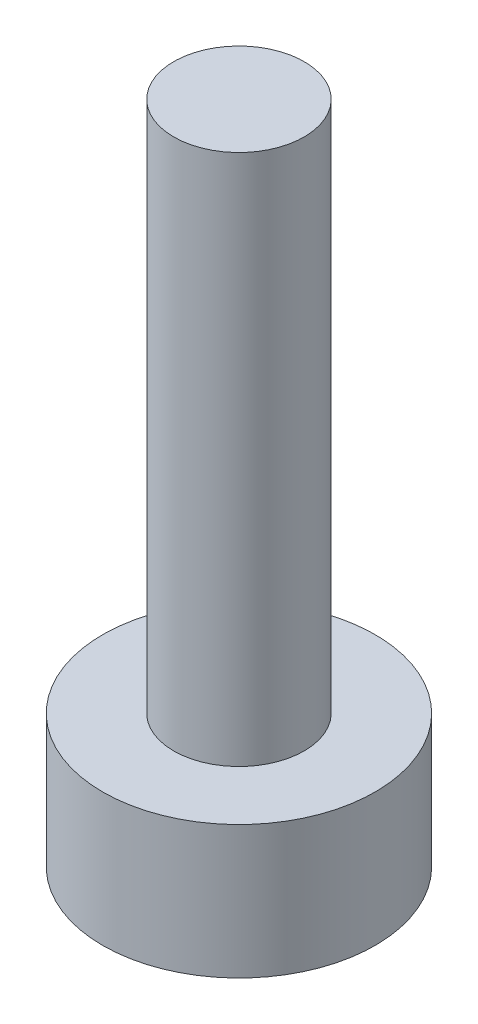
ISO-10303-21;
HEADER;
FILE_DESCRIPTION(('STEP AP214'),'2;1');
FILE_NAME('part.step','',(''),(''),'','','');
FILE_SCHEMA(('AUTOMOTIVE_DESIGN { 1 0 10303 214 1 1 1 1 }'));
ENDSEC;
DATA;
#1=APPLICATION_CONTEXT('core data for automotive mechanical design processes');
#2=APPLICATION_PROTOCOL_DEFINITION('international standard','automotive_design',2000,#1);
#3=PRODUCT_CONTEXT('',#1,'mechanical');
#4=PRODUCT('Part','Part','',(#3));
#5=PRODUCT_RELATED_PRODUCT_CATEGORY('part','',(#4));
#6=PRODUCT_DEFINITION_FORMATION('','',#4);
#7=PRODUCT_DEFINITION_CONTEXT('part definition',#1,'design');
#8=PRODUCT_DEFINITION('design','',#6,#7);
#9=PRODUCT_DEFINITION_SHAPE('','',#8);
#10=(LENGTH_UNIT() NAMED_UNIT(*) SI_UNIT(.MILLI.,.METRE.));
#11=(NAMED_UNIT(*) PLANE_ANGLE_UNIT() SI_UNIT($,.RADIAN.));
#12=(NAMED_UNIT(*) SI_UNIT($,.STERADIAN.) SOLID_ANGLE_UNIT());
#13=UNCERTAINTY_MEASURE_WITH_UNIT(LENGTH_MEASURE(1.E-05),#10,'distance_accuracy_value','');
#14=(GEOMETRIC_REPRESENTATION_CONTEXT(3) GLOBAL_UNCERTAINTY_ASSIGNED_CONTEXT((#13)) GLOBAL_UNIT_ASSIGNED_CONTEXT((#10,
#11,#12)) REPRESENTATION_CONTEXT('',''));
#15=CARTESIAN_POINT('',(0.,0.,0.));
#16=DIRECTION('',(0.,0.,1.));
#17=DIRECTION('',(1.,0.,0.));
#18=AXIS2_PLACEMENT_3D('',#15,#16,#17);
#19=CARTESIAN_POINT('',(0.,5.,0.));
#20=DIRECTION('',(0.,-1.,0.));
#21=DIRECTION('',(0.,0.,-1.));
#22=AXIS2_PLACEMENT_3D('',#19,#20,#21);
#23=CYLINDRICAL_SURFACE('',#22,5.125);
#24=CARTESIAN_POINT('',(0.,5.,0.));
#25=DIRECTION('',(0.,1.,0.));
#26=DIRECTION('',(0.,0.,1.));
#27=AXIS2_PLACEMENT_3D('',#24,#25,#26);
#28=CIRCLE('',#27,5.125);
#29=CARTESIAN_POINT('',(0.,5.,5.125));
#30=VERTEX_POINT('',#29);
#31=EDGE_CURVE('E56',#30,#30,#28,.T.);
#32=ORIENTED_EDGE('',*,*,#31,.F.);
#33=EDGE_LOOP('',(#32));
#34=FACE_BOUND('',#33,.T.);
#35=CARTESIAN_POINT('',(0.,0.,0.));
#36=DIRECTION('',(0.,1.,0.));
#37=DIRECTION('',(0.,0.,1.));
#38=AXIS2_PLACEMENT_3D('',#35,#36,#37);
#39=CIRCLE('',#38,5.125);
#40=CARTESIAN_POINT('',(0.,0.,5.125));
#41=VERTEX_POINT('',#40);
#42=EDGE_CURVE('E50',#41,#41,#39,.T.);
#43=ORIENTED_EDGE('',*,*,#42,.T.);
#44=EDGE_LOOP('',(#43));
#45=FACE_BOUND('',#44,.T.);
#46=ADVANCED_FACE('F47',(#34,#45),#23,.T.);
#47=CARTESIAN_POINT('',(0.,5.,0.));
#48=DIRECTION('',(0.,1.,0.));
#49=DIRECTION('',(0.,0.,1.));
#50=AXIS2_PLACEMENT_3D('',#47,#48,#49);
#51=PLANE('',#50);
#52=CARTESIAN_POINT('',(0.,5.,0.));
#53=DIRECTION('',(0.,1.,0.));
#54=DIRECTION('',(0.,0.,1.));
#55=AXIS2_PLACEMENT_3D('',#52,#53,#54);
#56=CIRCLE('',#55,2.45395365429869);
#57=CARTESIAN_POINT('',(0.,5.,2.45395365429869));
#58=VERTEX_POINT('',#57);
#59=EDGE_CURVE('E11',#58,#58,#56,.T.);
#60=ORIENTED_EDGE('',*,*,#59,.F.);
#61=EDGE_LOOP('',(#60));
#62=FACE_BOUND('',#61,.T.);
#63=ORIENTED_EDGE('',*,*,#31,.T.);
#64=EDGE_LOOP('',(#63));
#65=FACE_BOUND('',#64,.T.);
#66=ADVANCED_FACE('F187',(#62,#65),#51,.T.);
#67=CARTESIAN_POINT('',(0.,0.,0.));
#68=DIRECTION('',(0.,1.,0.));
#69=DIRECTION('',(0.,0.,1.));
#70=AXIS2_PLACEMENT_3D('',#67,#68,#69);
#71=PLANE('',#70);
#72=DIRECTION('',(-1.,0.,0.));
#73=VECTOR('',#72,1.);
#74=CARTESIAN_POINT('',(-2.45766341078746,0.,3.45877455539153));
#75=LINE('',#74,#73);
#76=CARTESIAN_POINT('',(2.45766341078746,0.,3.45877455539153));
#77=VERTEX_POINT('',#76);
#78=CARTESIAN_POINT('',(-2.45766341078746,0.,3.45877455539153));
#79=VERTEX_POINT('',#78);
#80=EDGE_CURVE('E144',#77,#79,#75,.T.);
#81=ORIENTED_EDGE('',*,*,#80,.F.);
#82=DIRECTION('',(-0.428713401701836,0.,0.903440545471167));
#83=VECTOR('',#82,1.);
#84=CARTESIAN_POINT('',(2.45766341078746,0.,3.45877455539153));
#85=LINE('',#84,#83);
#86=CARTESIAN_POINT('',(4.09897009421545,0.,0.));
#87=VERTEX_POINT('',#86);
#88=EDGE_CURVE('E64',#87,#77,#85,.T.);
#89=ORIENTED_EDGE('',*,*,#88,.F.);
#90=DIRECTION('',(0.428713401701836,0.,0.903440545471167));
#91=VECTOR('',#90,1.);
#92=CARTESIAN_POINT('',(2.45766341078746,0.,-3.45877455539153));
#93=LINE('',#92,#91);
#94=CARTESIAN_POINT('',(2.45766341078746,0.,-3.45877455539153));
#95=VERTEX_POINT('',#94);
#96=EDGE_CURVE('E157',#95,#87,#93,.T.);
#97=ORIENTED_EDGE('',*,*,#96,.F.);
#98=DIRECTION('',(1.,0.,0.));
#99=VECTOR('',#98,1.);
#100=CARTESIAN_POINT('',(-2.45766341078746,0.,-3.45877455539153));
#101=LINE('',#100,#99);
#102=CARTESIAN_POINT('',(-2.45766341078746,0.,-3.45877455539153));
#103=VERTEX_POINT('',#102);
#104=EDGE_CURVE('E154',#103,#95,#101,.T.);
#105=ORIENTED_EDGE('',*,*,#104,.F.);
#106=DIRECTION('',(0.428713401701836,0.,-0.903440545471167));
#107=VECTOR('',#106,1.);
#108=CARTESIAN_POINT('',(-2.45766341078746,0.,-3.45877455539153));
#109=LINE('',#108,#107);
#110=CARTESIAN_POINT('',(-4.09897009421545,0.,0.));
#111=VERTEX_POINT('',#110);
#112=EDGE_CURVE('E112',#111,#103,#109,.T.);
#113=ORIENTED_EDGE('',*,*,#112,.F.);
#114=DIRECTION('',(-0.428713401701836,0.,-0.903440545471167));
#115=VECTOR('',#114,1.);
#116=CARTESIAN_POINT('',(-2.45766341078746,0.,3.45877455539153));
#117=LINE('',#116,#115);
#118=EDGE_CURVE('E148',#79,#111,#117,.T.);
#119=ORIENTED_EDGE('',*,*,#118,.F.);
#120=EDGE_LOOP('',(#81,#89,#97,#105,#113,#119));
#121=FACE_BOUND('',#120,.T.);
#122=ORIENTED_EDGE('',*,*,#42,.F.);
#123=EDGE_LOOP('',(#122));
#124=FACE_BOUND('',#123,.T.);
#125=ADVANCED_FACE('F184',(#121,#124),#71,.F.);
#126=CARTESIAN_POINT('',(0.,25.,0.));
#127=DIRECTION('',(0.,-1.,0.));
#128=DIRECTION('',(0.,0.,-1.));
#129=AXIS2_PLACEMENT_3D('',#126,#127,#128);
#130=CYLINDRICAL_SURFACE('',#129,2.45395365429869);
#131=CARTESIAN_POINT('',(0.,25.,0.));
#132=DIRECTION('',(0.,1.,0.));
#133=DIRECTION('',(0.,0.,1.));
#134=AXIS2_PLACEMENT_3D('',#131,#132,#133);
#135=CIRCLE('',#134,2.45395365429869);
#136=CARTESIAN_POINT('',(0.,25.,2.45395365429869));
#137=VERTEX_POINT('',#136);
#138=EDGE_CURVE('E163',#137,#137,#135,.T.);
#139=ORIENTED_EDGE('',*,*,#138,.F.);
#140=EDGE_LOOP('',(#139));
#141=FACE_BOUND('',#140,.T.);
#142=ORIENTED_EDGE('',*,*,#59,.T.);
#143=EDGE_LOOP('',(#142));
#144=FACE_BOUND('',#143,.T.);
#145=ADVANCED_FACE('F186',(#141,#144),#130,.T.);
#146=CARTESIAN_POINT('',(0.,25.,0.));
#147=DIRECTION('',(0.,1.,0.));
#148=DIRECTION('',(0.,0.,1.));
#149=AXIS2_PLACEMENT_3D('',#146,#147,#148);
#150=PLANE('',#149);
#151=ORIENTED_EDGE('',*,*,#138,.T.);
#152=EDGE_LOOP('',(#151));
#153=FACE_BOUND('',#152,.T.);
#154=ADVANCED_FACE('F194',(#153),#150,.T.);
#155=CARTESIAN_POINT('',(2.45766341078746,1.5,3.45877455539153));
#156=DIRECTION('',(0.903440545471167,0.,0.428713401701836));
#157=DIRECTION('',(0.428713401701836,0.,-0.903440545471167));
#158=AXIS2_PLACEMENT_3D('',#155,#156,#157);
#159=PLANE('',#158);
#160=ORIENTED_EDGE('',*,*,#88,.T.);
#161=DIRECTION('',(0.,-1.,0.));
#162=VECTOR('',#161,1.);
#163=CARTESIAN_POINT('',(2.45766341078746,1.5,3.45877455539153));
#164=LINE('',#163,#162);
#165=CARTESIAN_POINT('',(2.45766341078746,1.5,3.45877455539153));
#166=VERTEX_POINT('',#165);
#167=EDGE_CURVE('E94',#166,#77,#164,.T.);
#168=ORIENTED_EDGE('',*,*,#167,.F.);
#169=DIRECTION('',(-0.428713401701836,0.,0.903440545471167));
#170=VECTOR('',#169,1.);
#171=CARTESIAN_POINT('',(2.45766341078746,1.5,3.45877455539153));
#172=LINE('',#171,#170);
#173=CARTESIAN_POINT('',(4.09897009421545,1.5,0.));
#174=VERTEX_POINT('',#173);
#175=EDGE_CURVE('E160',#174,#166,#172,.T.);
#176=ORIENTED_EDGE('',*,*,#175,.F.);
#177=DIRECTION('',(0.,-1.,0.));
#178=VECTOR('',#177,1.);
#179=CARTESIAN_POINT('',(4.09897009421545,1.5,0.));
#180=LINE('',#179,#178);
#181=EDGE_CURVE('E72',#174,#87,#180,.T.);
#182=ORIENTED_EDGE('',*,*,#181,.T.);
#183=EDGE_LOOP('',(#160,#168,#176,#182));
#184=FACE_BOUND('',#183,.T.);
#185=ADVANCED_FACE('F220',(#184),#159,.F.);
#186=CARTESIAN_POINT('',(2.45766341078746,1.5,-3.45877455539153));
#187=DIRECTION('',(0.903440545471167,0.,-0.428713401701836));
#188=DIRECTION('',(-0.428713401701836,0.,-0.903440545471167));
#189=AXIS2_PLACEMENT_3D('',#186,#187,#188);
#190=PLANE('',#189);
#191=ORIENTED_EDGE('',*,*,#96,.T.);
#192=ORIENTED_EDGE('',*,*,#181,.F.);
#193=DIRECTION('',(0.428713401701836,0.,0.903440545471167));
#194=VECTOR('',#193,1.);
#195=CARTESIAN_POINT('',(2.45766341078746,1.5,-3.45877455539153));
#196=LINE('',#195,#194);
#197=CARTESIAN_POINT('',(2.45766341078746,1.5,-3.45877455539153));
#198=VERTEX_POINT('',#197);
#199=EDGE_CURVE('E126',#198,#174,#196,.T.);
#200=ORIENTED_EDGE('',*,*,#199,.F.);
#201=DIRECTION('',(0.,-1.,0.));
#202=VECTOR('',#201,1.);
#203=CARTESIAN_POINT('',(2.45766341078746,1.5,-3.45877455539153));
#204=LINE('',#203,#202);
#205=EDGE_CURVE('E117',#198,#95,#204,.T.);
#206=ORIENTED_EDGE('',*,*,#205,.T.);
#207=EDGE_LOOP('',(#191,#192,#200,#206));
#208=FACE_BOUND('',#207,.T.);
#209=ADVANCED_FACE('F232',(#208),#190,.F.);
#210=CARTESIAN_POINT('',(-2.45766341078746,1.5,-3.45877455539153));
#211=DIRECTION('',(0.,0.,-1.));
#212=DIRECTION('',(-1.,0.,0.));
#213=AXIS2_PLACEMENT_3D('',#210,#211,#212);
#214=PLANE('',#213);
#215=ORIENTED_EDGE('',*,*,#104,.T.);
#216=ORIENTED_EDGE('',*,*,#205,.F.);
#217=DIRECTION('',(1.,0.,0.));
#218=VECTOR('',#217,1.);
#219=CARTESIAN_POINT('',(-2.45766341078746,1.5,-3.45877455539153));
#220=LINE('',#219,#218);
#221=CARTESIAN_POINT('',(-2.45766341078746,1.5,-3.45877455539153));
#222=VERTEX_POINT('',#221);
#223=EDGE_CURVE('E121',#222,#198,#220,.T.);
#224=ORIENTED_EDGE('',*,*,#223,.F.);
#225=DIRECTION('',(0.,-1.,0.));
#226=VECTOR('',#225,1.);
#227=CARTESIAN_POINT('',(-2.45766341078746,1.5,-3.45877455539153));
#228=LINE('',#227,#226);
#229=EDGE_CURVE('E105',#222,#103,#228,.T.);
#230=ORIENTED_EDGE('',*,*,#229,.T.);
#231=EDGE_LOOP('',(#215,#216,#224,#230));
#232=FACE_BOUND('',#231,.T.);
#233=ADVANCED_FACE('F122',(#232),#214,.F.);
#234=CARTESIAN_POINT('',(-2.45766341078746,1.5,-3.45877455539153));
#235=DIRECTION('',(-0.903440545471167,0.,-0.428713401701836));
#236=DIRECTION('',(-0.428713401701836,0.,0.903440545471167));
#237=AXIS2_PLACEMENT_3D('',#234,#235,#236);
#238=PLANE('',#237);
#239=ORIENTED_EDGE('',*,*,#112,.T.);
#240=ORIENTED_EDGE('',*,*,#229,.F.);
#241=DIRECTION('',(0.428713401701836,0.,-0.903440545471167));
#242=VECTOR('',#241,1.);
#243=CARTESIAN_POINT('',(-2.45766341078746,1.5,-3.45877455539153));
#244=LINE('',#243,#242);
#245=CARTESIAN_POINT('',(-4.09897009421545,1.5,0.));
#246=VERTEX_POINT('',#245);
#247=EDGE_CURVE('E109',#246,#222,#244,.T.);
#248=ORIENTED_EDGE('',*,*,#247,.F.);
#249=DIRECTION('',(0.,-1.,0.));
#250=VECTOR('',#249,1.);
#251=CARTESIAN_POINT('',(-4.09897009421545,1.5,0.));
#252=LINE('',#251,#250);
#253=EDGE_CURVE('E118',#246,#111,#252,.T.);
#254=ORIENTED_EDGE('',*,*,#253,.T.);
#255=EDGE_LOOP('',(#239,#240,#248,#254));
#256=FACE_BOUND('',#255,.T.);
#257=ADVANCED_FACE('F107',(#256),#238,.F.);
#258=CARTESIAN_POINT('',(-2.45766341078746,1.5,3.45877455539153));
#259=DIRECTION('',(-0.903440545471167,0.,0.428713401701836));
#260=DIRECTION('',(0.428713401701836,0.,0.903440545471167));
#261=AXIS2_PLACEMENT_3D('',#258,#259,#260);
#262=PLANE('',#261);
#263=ORIENTED_EDGE('',*,*,#118,.T.);
#264=ORIENTED_EDGE('',*,*,#253,.F.);
#265=DIRECTION('',(-0.428713401701836,0.,-0.903440545471167));
#266=VECTOR('',#265,1.);
#267=CARTESIAN_POINT('',(-2.45766341078746,1.5,3.45877455539153));
#268=LINE('',#267,#266);
#269=CARTESIAN_POINT('',(-2.45766341078746,1.5,3.45877455539153));
#270=VERTEX_POINT('',#269);
#271=EDGE_CURVE('E132',#270,#246,#268,.T.);
#272=ORIENTED_EDGE('',*,*,#271,.F.);
#273=DIRECTION('',(0.,-1.,0.));
#274=VECTOR('',#273,1.);
#275=CARTESIAN_POINT('',(-2.45766341078746,1.5,3.45877455539153));
#276=LINE('',#275,#274);
#277=EDGE_CURVE('E168',#270,#79,#276,.T.);
#278=ORIENTED_EDGE('',*,*,#277,.T.);
#279=EDGE_LOOP('',(#263,#264,#272,#278));
#280=FACE_BOUND('',#279,.T.);
#281=ADVANCED_FACE('F257',(#280),#262,.F.);
#282=CARTESIAN_POINT('',(-2.45766341078746,1.5,3.45877455539153));
#283=DIRECTION('',(0.,0.,1.));
#284=DIRECTION('',(1.,0.,0.));
#285=AXIS2_PLACEMENT_3D('',#282,#283,#284);
#286=PLANE('',#285);
#287=ORIENTED_EDGE('',*,*,#80,.T.);
#288=ORIENTED_EDGE('',*,*,#277,.F.);
#289=DIRECTION('',(-1.,0.,0.));
#290=VECTOR('',#289,1.);
#291=CARTESIAN_POINT('',(-2.45766341078746,1.5,3.45877455539153));
#292=LINE('',#291,#290);
#293=EDGE_CURVE('E136',#166,#270,#292,.T.);
#294=ORIENTED_EDGE('',*,*,#293,.F.);
#295=ORIENTED_EDGE('',*,*,#167,.T.);
#296=EDGE_LOOP('',(#287,#288,#294,#295));
#297=FACE_BOUND('',#296,.T.);
#298=ADVANCED_FACE('F266',(#297),#286,.F.);
#299=CARTESIAN_POINT('',(0.,1.5,0.));
#300=DIRECTION('',(0.,-1.,0.));
#301=DIRECTION('',(0.,0.,-1.));
#302=AXIS2_PLACEMENT_3D('',#299,#300,#301);
#303=PLANE('',#302);
#304=ORIENTED_EDGE('',*,*,#175,.T.);
#305=ORIENTED_EDGE('',*,*,#293,.T.);
#306=ORIENTED_EDGE('',*,*,#271,.T.);
#307=ORIENTED_EDGE('',*,*,#247,.T.);
#308=ORIENTED_EDGE('',*,*,#223,.T.);
#309=ORIENTED_EDGE('',*,*,#199,.T.);
#310=EDGE_LOOP('',(#304,#305,#306,#307,#308,#309));
#311=FACE_BOUND('',#310,.T.);
#312=ADVANCED_FACE('F129',(#311),#303,.T.);
#313=CLOSED_SHELL('',(#46,#66,#125,#145,#154,#185,#209,#233,#257,#281,#298,#312));
#314=MANIFOLD_SOLID_BREP('B2',#313);
#315=ADVANCED_BREP_SHAPE_REPRESENTATION('',(#18,#314),#14);
#316=SHAPE_DEFINITION_REPRESENTATION(#9,#315);
ENDSEC;
END-ISO-10303-21;
